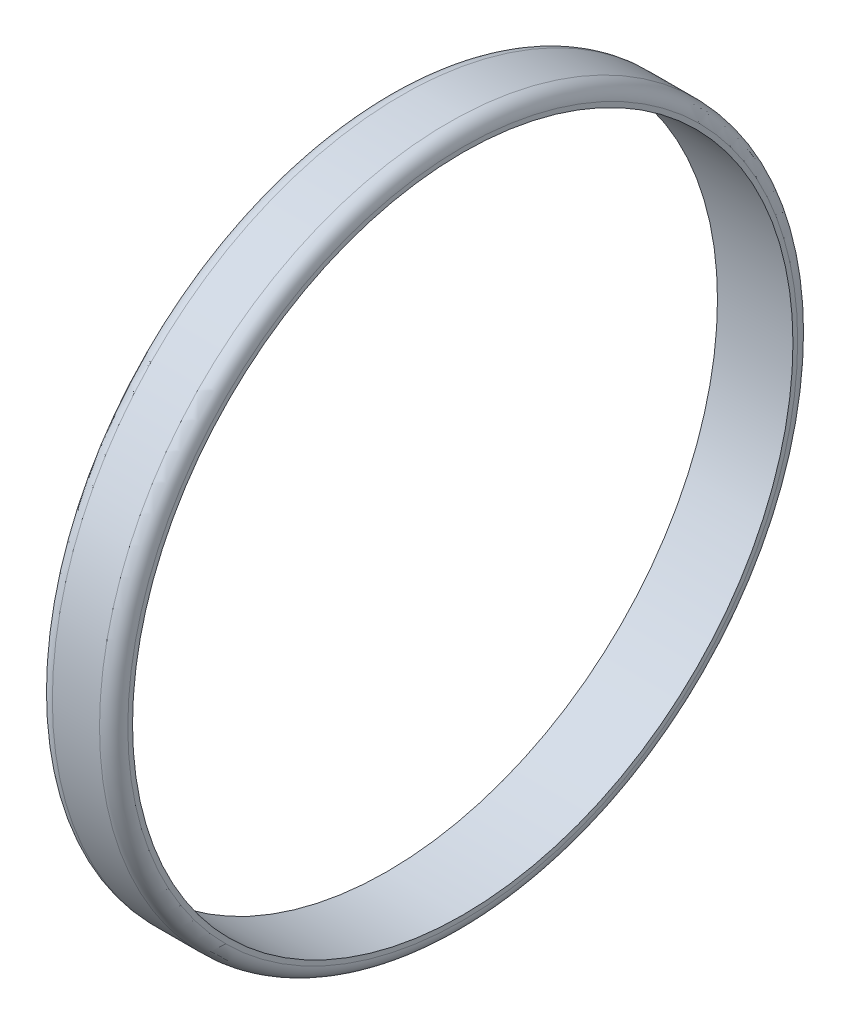
ISO-10303-21;
HEADER;
FILE_DESCRIPTION(('STEP AP214'),'2;1');
FILE_NAME('part.step','',(''),(''),'','','');
FILE_SCHEMA(('AUTOMOTIVE_DESIGN { 1 0 10303 214 1 1 1 1 }'));
ENDSEC;
DATA;
#1=APPLICATION_CONTEXT('core data for automotive mechanical design processes');
#2=APPLICATION_PROTOCOL_DEFINITION('international standard','automotive_design',2000,#1);
#3=PRODUCT_CONTEXT('',#1,'mechanical');
#4=PRODUCT('Part','Part','',(#3));
#5=PRODUCT_RELATED_PRODUCT_CATEGORY('part','',(#4));
#6=PRODUCT_DEFINITION_FORMATION('','',#4);
#7=PRODUCT_DEFINITION_CONTEXT('part definition',#1,'design');
#8=PRODUCT_DEFINITION('design','',#6,#7);
#9=PRODUCT_DEFINITION_SHAPE('','',#8);
#10=(LENGTH_UNIT() NAMED_UNIT(*) SI_UNIT(.MILLI.,.METRE.));
#11=(NAMED_UNIT(*) PLANE_ANGLE_UNIT() SI_UNIT($,.RADIAN.));
#12=(NAMED_UNIT(*) SI_UNIT($,.STERADIAN.) SOLID_ANGLE_UNIT());
#13=UNCERTAINTY_MEASURE_WITH_UNIT(LENGTH_MEASURE(1.E-05),#10,'distance_accuracy_value','');
#14=(GEOMETRIC_REPRESENTATION_CONTEXT(3) GLOBAL_UNCERTAINTY_ASSIGNED_CONTEXT((#13)) GLOBAL_UNIT_ASSIGNED_CONTEXT((#10,
#11,#12)) REPRESENTATION_CONTEXT('',''));
#15=CARTESIAN_POINT('',(0.,0.,0.));
#16=DIRECTION('',(0.,0.,1.));
#17=DIRECTION('',(1.,0.,0.));
#18=AXIS2_PLACEMENT_3D('',#15,#16,#17);
#19=CARTESIAN_POINT('',(8.,0.,0.));
#20=DIRECTION('',(-1.,0.,0.));
#21=DIRECTION('',(0.,0.,1.));
#22=AXIS2_PLACEMENT_3D('',#19,#20,#21);
#23=CYLINDRICAL_SURFACE('',#22,37.);
#24=CARTESIAN_POINT('',(1.5,0.,0.));
#25=DIRECTION('',(1.,0.,0.));
#26=DIRECTION('',(0.,0.,-1.));
#27=AXIS2_PLACEMENT_3D('',#24,#25,#26);
#28=CIRCLE('',#27,37.);
#29=CARTESIAN_POINT('',(1.5,0.,-37.));
#30=VERTEX_POINT('',#29);
#31=EDGE_CURVE('E57',#30,#30,#28,.T.);
#32=ORIENTED_EDGE('',*,*,#31,.T.);
#33=EDGE_LOOP('',(#32));
#34=FACE_BOUND('',#33,.T.);
#35=CARTESIAN_POINT('',(6.5,0.,0.));
#36=DIRECTION('',(1.,0.,0.));
#37=DIRECTION('',(0.,0.,-1.));
#38=AXIS2_PLACEMENT_3D('',#35,#36,#37);
#39=CIRCLE('',#38,37.);
#40=CARTESIAN_POINT('',(6.5,0.,-37.));
#41=VERTEX_POINT('',#40);
#42=EDGE_CURVE('E62',#41,#41,#39,.F.);
#43=ORIENTED_EDGE('',*,*,#42,.T.);
#44=EDGE_LOOP('',(#43));
#45=FACE_BOUND('',#44,.T.);
#46=ADVANCED_FACE('F43',(#34,#45),#23,.T.);
#47=CARTESIAN_POINT('',(8.,0.,0.));
#48=DIRECTION('',(1.,0.,0.));
#49=DIRECTION('',(0.,0.,-1.));
#50=AXIS2_PLACEMENT_3D('',#47,#48,#49);
#51=PLANE('',#50);
#52=CARTESIAN_POINT('',(8.,0.,0.));
#53=DIRECTION('',(1.,0.,0.));
#54=DIRECTION('',(0.,0.,-1.));
#55=AXIS2_PLACEMENT_3D('',#52,#53,#54);
#56=CIRCLE('',#55,35.);
#57=CARTESIAN_POINT('',(8.,0.,-35.));
#58=VERTEX_POINT('',#57);
#59=EDGE_CURVE('E67',#58,#58,#56,.T.);
#60=ORIENTED_EDGE('',*,*,#59,.F.);
#61=EDGE_LOOP('',(#60));
#62=FACE_BOUND('',#61,.T.);
#63=CARTESIAN_POINT('',(8.,0.,0.));
#64=DIRECTION('',(1.,0.,0.));
#65=DIRECTION('',(0.,0.,-1.));
#66=AXIS2_PLACEMENT_3D('',#63,#64,#65);
#67=CIRCLE('',#66,35.5);
#68=CARTESIAN_POINT('',(8.,0.,-35.5));
#69=VERTEX_POINT('',#68);
#70=EDGE_CURVE('E10',#69,#69,#67,.T.);
#71=ORIENTED_EDGE('',*,*,#70,.T.);
#72=EDGE_LOOP('',(#71));
#73=FACE_BOUND('',#72,.T.);
#74=ADVANCED_FACE('F85',(#62,#73),#51,.T.);
#75=CARTESIAN_POINT('',(0.,0.,0.));
#76=DIRECTION('',(1.,0.,0.));
#77=DIRECTION('',(0.,0.,-1.));
#78=AXIS2_PLACEMENT_3D('',#75,#76,#77);
#79=PLANE('',#78);
#80=CARTESIAN_POINT('',(0.,0.,0.));
#81=DIRECTION('',(1.,0.,0.));
#82=DIRECTION('',(0.,0.,-1.));
#83=AXIS2_PLACEMENT_3D('',#80,#81,#82);
#84=CIRCLE('',#83,35.);
#85=CARTESIAN_POINT('',(0.,0.,-35.));
#86=VERTEX_POINT('',#85);
#87=EDGE_CURVE('E69',#86,#86,#84,.T.);
#88=ORIENTED_EDGE('',*,*,#87,.T.);
#89=EDGE_LOOP('',(#88));
#90=FACE_BOUND('',#89,.T.);
#91=CARTESIAN_POINT('',(0.,0.,0.));
#92=DIRECTION('',(1.,0.,0.));
#93=DIRECTION('',(0.,0.,-1.));
#94=AXIS2_PLACEMENT_3D('',#91,#92,#93);
#95=CIRCLE('',#94,35.5);
#96=CARTESIAN_POINT('',(0.,0.,-35.5));
#97=VERTEX_POINT('',#96);
#98=EDGE_CURVE('E51',#97,#97,#95,.F.);
#99=ORIENTED_EDGE('',*,*,#98,.T.);
#100=EDGE_LOOP('',(#99));
#101=FACE_BOUND('',#100,.T.);
#102=ADVANCED_FACE('F77',(#90,#101),#79,.F.);
#103=CARTESIAN_POINT('',(1.5,0.,0.));
#104=DIRECTION('',(1.,0.,0.));
#105=DIRECTION('',(0.,0.,-1.));
#106=AXIS2_PLACEMENT_3D('',#103,#104,#105);
#107=TOROIDAL_SURFACE('',#106,35.5,1.5);
#108=ORIENTED_EDGE('',*,*,#98,.F.);
#109=EDGE_LOOP('',(#108));
#110=FACE_BOUND('',#109,.T.);
#111=ORIENTED_EDGE('',*,*,#31,.F.);
#112=EDGE_LOOP('',(#111));
#113=FACE_BOUND('',#112,.T.);
#114=ADVANCED_FACE('F93',(#110,#113),#107,.T.);
#115=CARTESIAN_POINT('',(6.5,0.,0.));
#116=DIRECTION('',(1.,0.,0.));
#117=DIRECTION('',(0.,0.,-1.));
#118=AXIS2_PLACEMENT_3D('',#115,#116,#117);
#119=TOROIDAL_SURFACE('',#118,35.5,1.5);
#120=ORIENTED_EDGE('',*,*,#42,.F.);
#121=EDGE_LOOP('',(#120));
#122=FACE_BOUND('',#121,.T.);
#123=ORIENTED_EDGE('',*,*,#70,.F.);
#124=EDGE_LOOP('',(#123));
#125=FACE_BOUND('',#124,.T.);
#126=ADVANCED_FACE('F44',(#122,#125),#119,.T.);
#127=CARTESIAN_POINT('',(0.,0.,0.));
#128=DIRECTION('',(1.,0.,0.));
#129=DIRECTION('',(0.,0.,-1.));
#130=AXIS2_PLACEMENT_3D('',#127,#128,#129);
#131=CYLINDRICAL_SURFACE('',#130,35.);
#132=ORIENTED_EDGE('',*,*,#87,.F.);
#133=EDGE_LOOP('',(#132));
#134=FACE_BOUND('',#133,.T.);
#135=ORIENTED_EDGE('',*,*,#59,.T.);
#136=EDGE_LOOP('',(#135));
#137=FACE_BOUND('',#136,.T.);
#138=ADVANCED_FACE('F79',(#134,#137),#131,.F.);
#139=CLOSED_SHELL('',(#46,#74,#102,#114,#126,#138));
#140=MANIFOLD_SOLID_BREP('B2',#139);
#141=ADVANCED_BREP_SHAPE_REPRESENTATION('',(#18,#140),#14);
#142=SHAPE_DEFINITION_REPRESENTATION(#9,#141);
ENDSEC;
END-ISO-10303-21;
